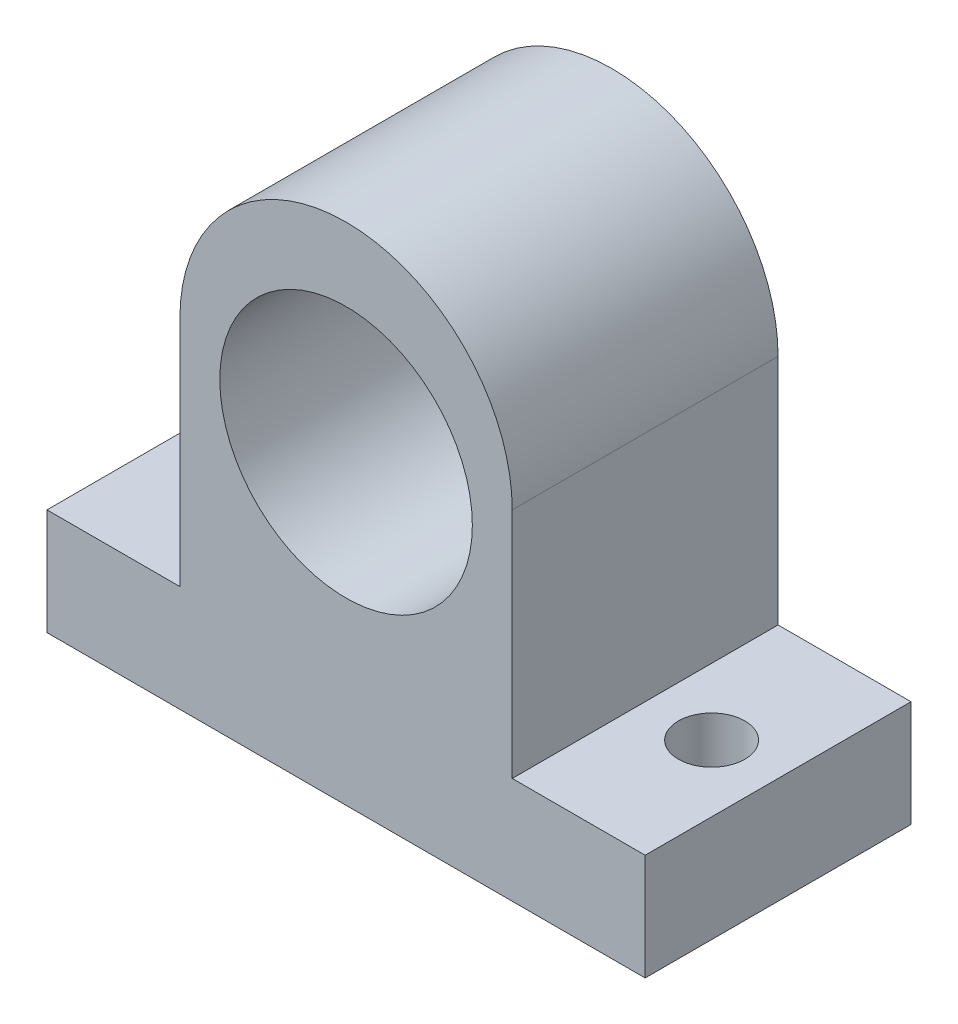
ISO-10303-21;
HEADER;
FILE_DESCRIPTION(('STEP AP214'),'2;1');
FILE_NAME('part.step','',(''),(''),'','','');
FILE_SCHEMA(('AUTOMOTIVE_DESIGN { 1 0 10303 214 1 1 1 1 }'));
ENDSEC;
DATA;
#1=APPLICATION_CONTEXT('core data for automotive mechanical design processes');
#2=APPLICATION_PROTOCOL_DEFINITION('international standard','automotive_design',2000,#1);
#3=PRODUCT_CONTEXT('',#1,'mechanical');
#4=PRODUCT('Part','Part','',(#3));
#5=PRODUCT_RELATED_PRODUCT_CATEGORY('part','',(#4));
#6=PRODUCT_DEFINITION_FORMATION('','',#4);
#7=PRODUCT_DEFINITION_CONTEXT('part definition',#1,'design');
#8=PRODUCT_DEFINITION('design','',#6,#7);
#9=PRODUCT_DEFINITION_SHAPE('','',#8);
#10=(LENGTH_UNIT() NAMED_UNIT(*) SI_UNIT(.MILLI.,.METRE.));
#11=(NAMED_UNIT(*) PLANE_ANGLE_UNIT() SI_UNIT($,.RADIAN.));
#12=(NAMED_UNIT(*) SI_UNIT($,.STERADIAN.) SOLID_ANGLE_UNIT());
#13=UNCERTAINTY_MEASURE_WITH_UNIT(LENGTH_MEASURE(1.E-05),#10,'distance_accuracy_value','');
#14=(GEOMETRIC_REPRESENTATION_CONTEXT(3) GLOBAL_UNCERTAINTY_ASSIGNED_CONTEXT((#13)) GLOBAL_UNIT_ASSIGNED_CONTEXT((#10,
#11,#12)) REPRESENTATION_CONTEXT('',''));
#15=CARTESIAN_POINT('',(0.,0.,0.));
#16=DIRECTION('',(0.,0.,1.));
#17=DIRECTION('',(1.,0.,0.));
#18=AXIS2_PLACEMENT_3D('',#15,#16,#17);
#19=CARTESIAN_POINT('',(0.,25.5,9.99999999999999));
#20=DIRECTION('',(0.,0.,1.));
#21=DIRECTION('',(1.,0.,0.));
#22=AXIS2_PLACEMENT_3D('',#19,#20,#21);
#23=CYLINDRICAL_SURFACE('',#22,12.5);
#24=DIRECTION('',(0.,0.,-1.));
#25=VECTOR('',#24,1.);
#26=CARTESIAN_POINT('',(-12.5,25.5,10.));
#27=LINE('',#26,#25);
#28=CARTESIAN_POINT('',(-12.5,25.5,10.));
#29=VERTEX_POINT('',#28);
#30=CARTESIAN_POINT('',(-12.5,25.5,-10.));
#31=VERTEX_POINT('',#30);
#32=EDGE_CURVE('E159',#29,#31,#27,.T.);
#33=ORIENTED_EDGE('',*,*,#32,.F.);
#34=CARTESIAN_POINT('',(0.,25.5,10.));
#35=DIRECTION('',(0.,0.,-1.));
#36=DIRECTION('',(-1.,0.,0.));
#37=AXIS2_PLACEMENT_3D('',#34,#35,#36);
#38=CIRCLE('',#37,12.5);
#39=CARTESIAN_POINT('',(12.5,25.5,10.));
#40=VERTEX_POINT('',#39);
#41=EDGE_CURVE('E43',#40,#29,#38,.F.);
#42=ORIENTED_EDGE('',*,*,#41,.F.);
#43=DIRECTION('',(0.,0.,-1.));
#44=VECTOR('',#43,1.);
#45=CARTESIAN_POINT('',(12.5,25.5,9.99999999999999));
#46=LINE('',#45,#44);
#47=CARTESIAN_POINT('',(12.5,25.5,-10.));
#48=VERTEX_POINT('',#47);
#49=EDGE_CURVE('E161',#48,#40,#46,.F.);
#50=ORIENTED_EDGE('',*,*,#49,.F.);
#51=CARTESIAN_POINT('',(0.,25.5,-10.));
#52=DIRECTION('',(0.,0.,1.));
#53=DIRECTION('',(1.,0.,0.));
#54=AXIS2_PLACEMENT_3D('',#51,#52,#53);
#55=CIRCLE('',#54,12.5);
#56=EDGE_CURVE('E11',#31,#48,#55,.F.);
#57=ORIENTED_EDGE('',*,*,#56,.F.);
#58=EDGE_LOOP('',(#33,#42,#50,#57));
#59=FACE_BOUND('',#58,.T.);
#60=ADVANCED_FACE('F35',(#59),#23,.T.);
#61=CARTESIAN_POINT('',(0.,8.,0.));
#62=DIRECTION('',(0.,1.,0.));
#63=DIRECTION('',(0.,0.,1.));
#64=AXIS2_PLACEMENT_3D('',#61,#62,#63);
#65=PLANE('',#64);
#66=CARTESIAN_POINT('',(17.5,8.,0.));
#67=DIRECTION('',(0.,1.,0.));
#68=DIRECTION('',(0.,0.,1.));
#69=AXIS2_PLACEMENT_3D('',#66,#67,#68);
#70=CIRCLE('',#69,2.5);
#71=CARTESIAN_POINT('',(17.5,8.,2.5));
#72=VERTEX_POINT('',#71);
#73=EDGE_CURVE('E220',#72,#72,#70,.T.);
#74=ORIENTED_EDGE('',*,*,#73,.F.);
#75=EDGE_LOOP('',(#74));
#76=FACE_BOUND('',#75,.T.);
#77=DIRECTION('',(0.,0.,-1.));
#78=VECTOR('',#77,1.);
#79=CARTESIAN_POINT('',(12.5,8.,-10.));
#80=LINE('',#79,#78);
#81=CARTESIAN_POINT('',(12.5,8.,10.));
#82=VERTEX_POINT('',#81);
#83=CARTESIAN_POINT('',(12.5,8.,-10.));
#84=VERTEX_POINT('',#83);
#85=EDGE_CURVE('E121',#82,#84,#80,.T.);
#86=ORIENTED_EDGE('',*,*,#85,.F.);
#87=DIRECTION('',(1.,0.,0.));
#88=VECTOR('',#87,1.);
#89=CARTESIAN_POINT('',(-22.5,8.,10.));
#90=LINE('',#89,#88);
#91=CARTESIAN_POINT('',(22.5,8.,10.));
#92=VERTEX_POINT('',#91);
#93=EDGE_CURVE('E118',#82,#92,#90,.T.);
#94=ORIENTED_EDGE('',*,*,#93,.T.);
#95=DIRECTION('',(0.,0.,-1.));
#96=VECTOR('',#95,1.);
#97=CARTESIAN_POINT('',(22.5,8.,-10.));
#98=LINE('',#97,#96);
#99=CARTESIAN_POINT('',(22.5,8.,-10.));
#100=VERTEX_POINT('',#99);
#101=EDGE_CURVE('E133',#92,#100,#98,.T.);
#102=ORIENTED_EDGE('',*,*,#101,.T.);
#103=DIRECTION('',(-1.,0.,0.));
#104=VECTOR('',#103,1.);
#105=CARTESIAN_POINT('',(-22.5,8.,-10.));
#106=LINE('',#105,#104);
#107=EDGE_CURVE('E138',#100,#84,#106,.T.);
#108=ORIENTED_EDGE('',*,*,#107,.T.);
#109=EDGE_LOOP('',(#86,#94,#102,#108));
#110=FACE_BOUND('',#109,.T.);
#111=ADVANCED_FACE('F170',(#76,#110),#65,.T.);
#112=CARTESIAN_POINT('',(22.5,8.,-10.));
#113=DIRECTION('',(-1.,0.,0.));
#114=DIRECTION('',(0.,0.,1.));
#115=AXIS2_PLACEMENT_3D('',#112,#113,#114);
#116=PLANE('',#115);
#117=DIRECTION('',(0.,0.,-1.));
#118=VECTOR('',#117,1.);
#119=CARTESIAN_POINT('',(22.5,0.,-10.));
#120=LINE('',#119,#118);
#121=CARTESIAN_POINT('',(22.5,0.,10.));
#122=VERTEX_POINT('',#121);
#123=CARTESIAN_POINT('',(22.5,0.,-10.));
#124=VERTEX_POINT('',#123);
#125=EDGE_CURVE('E132',#122,#124,#120,.T.);
#126=ORIENTED_EDGE('',*,*,#125,.T.);
#127=DIRECTION('',(0.,-1.,0.));
#128=VECTOR('',#127,1.);
#129=CARTESIAN_POINT('',(22.5,8.,-10.));
#130=LINE('',#129,#128);
#131=EDGE_CURVE('E156',#100,#124,#130,.T.);
#132=ORIENTED_EDGE('',*,*,#131,.F.);
#133=ORIENTED_EDGE('',*,*,#101,.F.);
#134=DIRECTION('',(0.,-1.,0.));
#135=VECTOR('',#134,1.);
#136=CARTESIAN_POINT('',(22.5,8.,10.));
#137=LINE('',#136,#135);
#138=EDGE_CURVE('E117',#92,#122,#137,.T.);
#139=ORIENTED_EDGE('',*,*,#138,.T.);
#140=EDGE_LOOP('',(#126,#132,#133,#139));
#141=FACE_BOUND('',#140,.T.);
#142=ADVANCED_FACE('F176',(#141),#116,.F.);
#143=CARTESIAN_POINT('',(-22.5,8.,-10.));
#144=DIRECTION('',(0.,0.,1.));
#145=DIRECTION('',(1.,0.,0.));
#146=AXIS2_PLACEMENT_3D('',#143,#144,#145);
#147=PLANE('',#146);
#148=CARTESIAN_POINT('',(0.,23.,-10.));
#149=DIRECTION('',(0.,0.,1.));
#150=DIRECTION('',(1.,0.,0.));
#151=AXIS2_PLACEMENT_3D('',#148,#149,#150);
#152=CIRCLE('',#151,9.5);
#153=CARTESIAN_POINT('',(9.5,23.,-10.));
#154=VERTEX_POINT('',#153);
#155=EDGE_CURVE('E222',#154,#154,#152,.F.);
#156=ORIENTED_EDGE('',*,*,#155,.F.);
#157=EDGE_LOOP('',(#156));
#158=FACE_BOUND('',#157,.T.);
#159=DIRECTION('',(0.,-1.,0.));
#160=VECTOR('',#159,1.);
#161=CARTESIAN_POINT('',(-12.5,38.,-10.));
#162=LINE('',#161,#160);
#163=CARTESIAN_POINT('',(-12.5,8.,-10.));
#164=VERTEX_POINT('',#163);
#165=EDGE_CURVE('E106',#31,#164,#162,.T.);
#166=ORIENTED_EDGE('',*,*,#165,.F.);
#167=ORIENTED_EDGE('',*,*,#56,.T.);
#168=DIRECTION('',(0.,-1.,0.));
#169=VECTOR('',#168,1.);
#170=CARTESIAN_POINT('',(12.5,38.,-10.));
#171=LINE('',#170,#169);
#172=EDGE_CURVE('E130',#48,#84,#171,.T.);
#173=ORIENTED_EDGE('',*,*,#172,.T.);
#174=ORIENTED_EDGE('',*,*,#107,.F.);
#175=ORIENTED_EDGE('',*,*,#131,.T.);
#176=DIRECTION('',(-1.,0.,0.));
#177=VECTOR('',#176,1.);
#178=CARTESIAN_POINT('',(-22.5,0.,-10.));
#179=LINE('',#178,#177);
#180=CARTESIAN_POINT('',(-22.5,0.,-10.));
#181=VERTEX_POINT('',#180);
#182=EDGE_CURVE('E144',#124,#181,#179,.T.);
#183=ORIENTED_EDGE('',*,*,#182,.T.);
#184=DIRECTION('',(0.,-1.,0.));
#185=VECTOR('',#184,1.);
#186=CARTESIAN_POINT('',(-22.5,8.,-10.));
#187=LINE('',#186,#185);
#188=CARTESIAN_POINT('',(-22.5,8.,-10.));
#189=VERTEX_POINT('',#188);
#190=EDGE_CURVE('E153',#189,#181,#187,.T.);
#191=ORIENTED_EDGE('',*,*,#190,.F.);
#192=EDGE_CURVE('E136',#164,#189,#106,.T.);
#193=ORIENTED_EDGE('',*,*,#192,.F.);
#194=EDGE_LOOP('',(#166,#167,#173,#174,#175,#183,#191,#193));
#195=FACE_BOUND('',#194,.T.);
#196=ADVANCED_FACE('F172',(#158,#195),#147,.F.);
#197=CARTESIAN_POINT('',(-22.5,8.,-10.));
#198=DIRECTION('',(1.,0.,0.));
#199=DIRECTION('',(0.,0.,-1.));
#200=AXIS2_PLACEMENT_3D('',#197,#198,#199);
#201=PLANE('',#200);
#202=DIRECTION('',(0.,0.,1.));
#203=VECTOR('',#202,1.);
#204=CARTESIAN_POINT('',(-22.5,0.,-10.));
#205=LINE('',#204,#203);
#206=CARTESIAN_POINT('',(-22.5,0.,10.));
#207=VERTEX_POINT('',#206);
#208=EDGE_CURVE('E146',#181,#207,#205,.T.);
#209=ORIENTED_EDGE('',*,*,#208,.T.);
#210=DIRECTION('',(0.,-1.,0.));
#211=VECTOR('',#210,1.);
#212=CARTESIAN_POINT('',(-22.5,8.,10.));
#213=LINE('',#212,#211);
#214=CARTESIAN_POINT('',(-22.5,8.,10.));
#215=VERTEX_POINT('',#214);
#216=EDGE_CURVE('E151',#215,#207,#213,.T.);
#217=ORIENTED_EDGE('',*,*,#216,.F.);
#218=DIRECTION('',(0.,0.,1.));
#219=VECTOR('',#218,1.);
#220=CARTESIAN_POINT('',(-22.5,8.,-10.));
#221=LINE('',#220,#219);
#222=EDGE_CURVE('E115',#189,#215,#221,.T.);
#223=ORIENTED_EDGE('',*,*,#222,.F.);
#224=ORIENTED_EDGE('',*,*,#190,.T.);
#225=EDGE_LOOP('',(#209,#217,#223,#224));
#226=FACE_BOUND('',#225,.T.);
#227=ADVANCED_FACE('F182',(#226),#201,.F.);
#228=CARTESIAN_POINT('',(-22.5,8.,10.));
#229=DIRECTION('',(0.,0.,-1.));
#230=DIRECTION('',(-1.,0.,0.));
#231=AXIS2_PLACEMENT_3D('',#228,#229,#230);
#232=PLANE('',#231);
#233=CARTESIAN_POINT('',(0.,23.,10.));
#234=DIRECTION('',(0.,0.,1.));
#235=DIRECTION('',(1.,0.,0.));
#236=AXIS2_PLACEMENT_3D('',#233,#234,#235);
#237=CIRCLE('',#236,9.5);
#238=CARTESIAN_POINT('',(9.5,23.,10.));
#239=VERTEX_POINT('',#238);
#240=EDGE_CURVE('E228',#239,#239,#237,.T.);
#241=ORIENTED_EDGE('',*,*,#240,.F.);
#242=EDGE_LOOP('',(#241));
#243=FACE_BOUND('',#242,.T.);
#244=DIRECTION('',(0.,-1.,0.));
#245=VECTOR('',#244,1.);
#246=CARTESIAN_POINT('',(12.5,38.,10.));
#247=LINE('',#246,#245);
#248=EDGE_CURVE('E107',#40,#82,#247,.T.);
#249=ORIENTED_EDGE('',*,*,#248,.F.);
#250=ORIENTED_EDGE('',*,*,#41,.T.);
#251=DIRECTION('',(0.,-1.,0.));
#252=VECTOR('',#251,1.);
#253=CARTESIAN_POINT('',(-12.5,38.,10.));
#254=LINE('',#253,#252);
#255=CARTESIAN_POINT('',(-12.5,8.,10.));
#256=VERTEX_POINT('',#255);
#257=EDGE_CURVE('E97',#29,#256,#254,.T.);
#258=ORIENTED_EDGE('',*,*,#257,.T.);
#259=EDGE_CURVE('E102',#215,#256,#90,.T.);
#260=ORIENTED_EDGE('',*,*,#259,.F.);
#261=ORIENTED_EDGE('',*,*,#216,.T.);
#262=DIRECTION('',(1.,0.,0.));
#263=VECTOR('',#262,1.);
#264=CARTESIAN_POINT('',(-22.5,0.,10.));
#265=LINE('',#264,#263);
#266=EDGE_CURVE('E137',#207,#122,#265,.T.);
#267=ORIENTED_EDGE('',*,*,#266,.T.);
#268=ORIENTED_EDGE('',*,*,#138,.F.);
#269=ORIENTED_EDGE('',*,*,#93,.F.);
#270=EDGE_LOOP('',(#249,#250,#258,#260,#261,#267,#268,#269));
#271=FACE_BOUND('',#270,.T.);
#272=ADVANCED_FACE('F100',(#243,#271),#232,.F.);
#273=CARTESIAN_POINT('',(-17.5,8.,0.));
#274=DIRECTION('',(0.,1.,0.));
#275=DIRECTION('',(0.,0.,1.));
#276=AXIS2_PLACEMENT_3D('',#273,#274,#275);
#277=CIRCLE('',#276,2.5);
#278=CARTESIAN_POINT('',(-17.5,8.,2.5));
#279=VERTEX_POINT('',#278);
#280=EDGE_CURVE('E213',#279,#279,#277,.T.);
#281=ORIENTED_EDGE('',*,*,#280,.F.);
#282=EDGE_LOOP('',(#281));
#283=FACE_BOUND('',#282,.T.);
#284=DIRECTION('',(0.,0.,1.));
#285=VECTOR('',#284,1.);
#286=CARTESIAN_POINT('',(-12.5,8.,-10.));
#287=LINE('',#286,#285);
#288=EDGE_CURVE('E112',#164,#256,#287,.T.);
#289=ORIENTED_EDGE('',*,*,#288,.F.);
#290=ORIENTED_EDGE('',*,*,#192,.T.);
#291=ORIENTED_EDGE('',*,*,#222,.T.);
#292=ORIENTED_EDGE('',*,*,#259,.T.);
#293=EDGE_LOOP('',(#289,#290,#291,#292));
#294=FACE_BOUND('',#293,.T.);
#295=ADVANCED_FACE('F111',(#283,#294),#65,.T.);
#296=CARTESIAN_POINT('',(0.,0.,0.));
#297=DIRECTION('',(0.,1.,0.));
#298=DIRECTION('',(0.,0.,1.));
#299=AXIS2_PLACEMENT_3D('',#296,#297,#298);
#300=PLANE('',#299);
#301=CARTESIAN_POINT('',(-17.5,0.,0.));
#302=DIRECTION('',(0.,1.,0.));
#303=DIRECTION('',(0.,0.,1.));
#304=AXIS2_PLACEMENT_3D('',#301,#302,#303);
#305=CIRCLE('',#304,2.5);
#306=CARTESIAN_POINT('',(-17.5,0.,2.5));
#307=VERTEX_POINT('',#306);
#308=EDGE_CURVE('E125',#307,#307,#305,.F.);
#309=ORIENTED_EDGE('',*,*,#308,.F.);
#310=EDGE_LOOP('',(#309));
#311=FACE_BOUND('',#310,.T.);
#312=CARTESIAN_POINT('',(17.5,0.,0.));
#313=DIRECTION('',(0.,1.,0.));
#314=DIRECTION('',(0.,0.,1.));
#315=AXIS2_PLACEMENT_3D('',#312,#313,#314);
#316=CIRCLE('',#315,2.5);
#317=CARTESIAN_POINT('',(17.5,0.,2.5));
#318=VERTEX_POINT('',#317);
#319=EDGE_CURVE('E215',#318,#318,#316,.F.);
#320=ORIENTED_EDGE('',*,*,#319,.F.);
#321=EDGE_LOOP('',(#320));
#322=FACE_BOUND('',#321,.T.);
#323=ORIENTED_EDGE('',*,*,#125,.F.);
#324=ORIENTED_EDGE('',*,*,#266,.F.);
#325=ORIENTED_EDGE('',*,*,#208,.F.);
#326=ORIENTED_EDGE('',*,*,#182,.F.);
#327=EDGE_LOOP('',(#323,#324,#325,#326));
#328=FACE_BOUND('',#327,.T.);
#329=ADVANCED_FACE('F179',(#311,#322,#328),#300,.F.);
#330=CARTESIAN_POINT('',(12.5,38.,-10.));
#331=DIRECTION('',(-1.,0.,0.));
#332=DIRECTION('',(0.,0.,1.));
#333=AXIS2_PLACEMENT_3D('',#330,#331,#332);
#334=PLANE('',#333);
#335=ORIENTED_EDGE('',*,*,#172,.F.);
#336=ORIENTED_EDGE('',*,*,#49,.T.);
#337=ORIENTED_EDGE('',*,*,#248,.T.);
#338=ORIENTED_EDGE('',*,*,#85,.T.);
#339=EDGE_LOOP('',(#335,#336,#337,#338));
#340=FACE_BOUND('',#339,.T.);
#341=ADVANCED_FACE('F164',(#340),#334,.F.);
#342=CARTESIAN_POINT('',(-12.5,38.,-10.));
#343=DIRECTION('',(1.,0.,0.));
#344=DIRECTION('',(0.,0.,-1.));
#345=AXIS2_PLACEMENT_3D('',#342,#343,#344);
#346=PLANE('',#345);
#347=ORIENTED_EDGE('',*,*,#257,.F.);
#348=ORIENTED_EDGE('',*,*,#32,.T.);
#349=ORIENTED_EDGE('',*,*,#165,.T.);
#350=ORIENTED_EDGE('',*,*,#288,.T.);
#351=EDGE_LOOP('',(#347,#348,#349,#350));
#352=FACE_BOUND('',#351,.T.);
#353=ADVANCED_FACE('F120',(#352),#346,.F.);
#354=CARTESIAN_POINT('',(17.5,-7.07106781186547,0.));
#355=DIRECTION('',(0.,1.,0.));
#356=DIRECTION('',(0.,0.,1.));
#357=AXIS2_PLACEMENT_3D('',#354,#355,#356);
#358=CYLINDRICAL_SURFACE('',#357,2.5);
#359=ORIENTED_EDGE('',*,*,#319,.T.);
#360=EDGE_LOOP('',(#359));
#361=FACE_BOUND('',#360,.T.);
#362=ORIENTED_EDGE('',*,*,#73,.T.);
#363=EDGE_LOOP('',(#362));
#364=FACE_BOUND('',#363,.T.);
#365=ADVANCED_FACE('F241',(#361,#364),#358,.F.);
#366=CARTESIAN_POINT('',(-17.5,-7.07106781186547,0.));
#367=DIRECTION('',(0.,1.,0.));
#368=DIRECTION('',(0.,0.,1.));
#369=AXIS2_PLACEMENT_3D('',#366,#367,#368);
#370=CYLINDRICAL_SURFACE('',#369,2.5);
#371=ORIENTED_EDGE('',*,*,#308,.T.);
#372=EDGE_LOOP('',(#371));
#373=FACE_BOUND('',#372,.T.);
#374=ORIENTED_EDGE('',*,*,#280,.T.);
#375=EDGE_LOOP('',(#374));
#376=FACE_BOUND('',#375,.T.);
#377=ADVANCED_FACE('F236',(#373,#376),#370,.F.);
#378=CARTESIAN_POINT('',(0.,23.,-36.8700576850888));
#379=DIRECTION('',(0.,0.,1.));
#380=DIRECTION('',(1.,0.,0.));
#381=AXIS2_PLACEMENT_3D('',#378,#379,#380);
#382=CYLINDRICAL_SURFACE('',#381,9.5);
#383=ORIENTED_EDGE('',*,*,#155,.T.);
#384=EDGE_LOOP('',(#383));
#385=FACE_BOUND('',#384,.T.);
#386=ORIENTED_EDGE('',*,*,#240,.T.);
#387=EDGE_LOOP('',(#386));
#388=FACE_BOUND('',#387,.T.);
#389=ADVANCED_FACE('F234',(#385,#388),#382,.F.);
#390=CLOSED_SHELL('',(#60,#111,#142,#196,#227,#272,#295,#329,#341,#353,#365,#377,#389));
#391=MANIFOLD_SOLID_BREP('B2',#390);
#392=ADVANCED_BREP_SHAPE_REPRESENTATION('',(#18,#391),#14);
#393=SHAPE_DEFINITION_REPRESENTATION(#9,#392);
ENDSEC;
END-ISO-10303-21;
